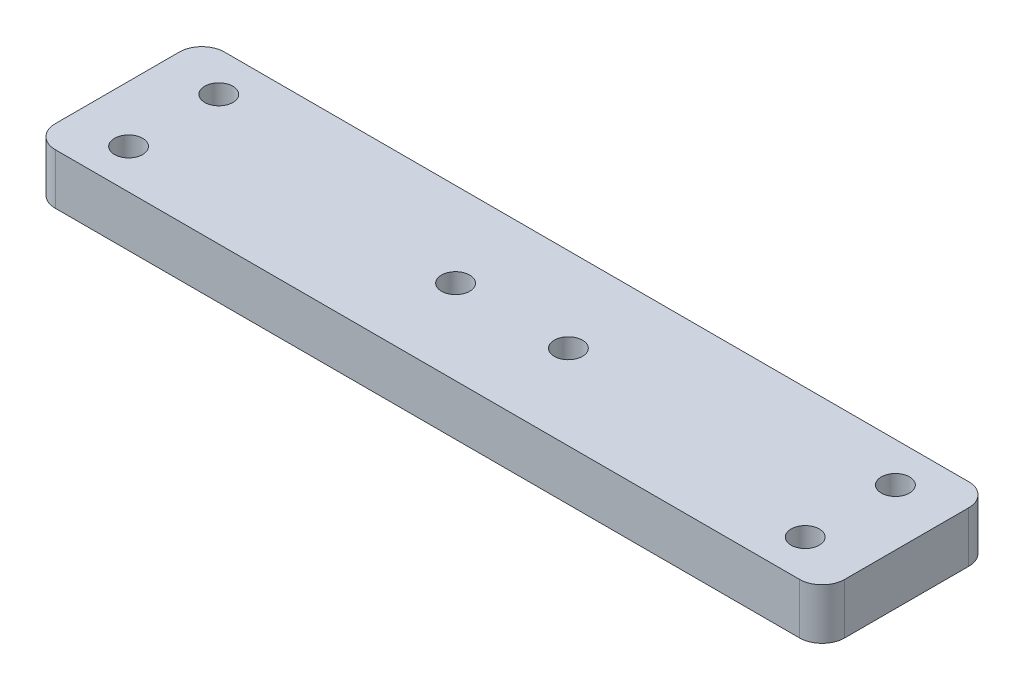
ISO-10303-21;
HEADER;
FILE_DESCRIPTION(('STEP AP214'),'2;1');
FILE_NAME('part.step','',(''),(''),'','','');
FILE_SCHEMA(('AUTOMOTIVE_DESIGN { 1 0 10303 214 1 1 1 1 }'));
ENDSEC;
DATA;
#1=APPLICATION_CONTEXT('core data for automotive mechanical design processes');
#2=APPLICATION_PROTOCOL_DEFINITION('international standard','automotive_design',2000,#1);
#3=PRODUCT_CONTEXT('',#1,'mechanical');
#4=PRODUCT('Part','Part','',(#3));
#5=PRODUCT_RELATED_PRODUCT_CATEGORY('part','',(#4));
#6=PRODUCT_DEFINITION_FORMATION('','',#4);
#7=PRODUCT_DEFINITION_CONTEXT('part definition',#1,'design');
#8=PRODUCT_DEFINITION('design','',#6,#7);
#9=PRODUCT_DEFINITION_SHAPE('','',#8);
#10=(LENGTH_UNIT() NAMED_UNIT(*) SI_UNIT(.MILLI.,.METRE.));
#11=(NAMED_UNIT(*) PLANE_ANGLE_UNIT() SI_UNIT($,.RADIAN.));
#12=(NAMED_UNIT(*) SI_UNIT($,.STERADIAN.) SOLID_ANGLE_UNIT());
#13=UNCERTAINTY_MEASURE_WITH_UNIT(LENGTH_MEASURE(1.E-05),#10,'distance_accuracy_value','');
#14=(GEOMETRIC_REPRESENTATION_CONTEXT(3) GLOBAL_UNCERTAINTY_ASSIGNED_CONTEXT((#13)) GLOBAL_UNIT_ASSIGNED_CONTEXT((#10,
#11,#12)) REPRESENTATION_CONTEXT('',''));
#15=CARTESIAN_POINT('',(0.,0.,0.));
#16=DIRECTION('',(0.,0.,1.));
#17=DIRECTION('',(1.,0.,0.));
#18=AXIS2_PLACEMENT_3D('',#15,#16,#17);
#19=CARTESIAN_POINT('',(33.,4.5,-5.5));
#20=DIRECTION('',(0.,1.,0.));
#21=DIRECTION('',(0.,0.,1.));
#22=AXIS2_PLACEMENT_3D('',#19,#20,#21);
#23=PLANE('',#22);
#24=CARTESIAN_POINT('',(-30.,4.5,4.));
#25=DIRECTION('',(0.,1.,0.));
#26=DIRECTION('',(0.,0.,1.));
#27=AXIS2_PLACEMENT_3D('',#24,#25,#26);
#28=CIRCLE('',#27,1.25);
#29=CARTESIAN_POINT('',(-30.,4.5,5.25));
#30=VERTEX_POINT('',#29);
#31=EDGE_CURVE('E203',#30,#30,#28,.T.);
#32=ORIENTED_EDGE('',*,*,#31,.F.);
#33=EDGE_LOOP('',(#32));
#34=FACE_BOUND('',#33,.T.);
#35=CARTESIAN_POINT('',(5.,4.5,0.));
#36=DIRECTION('',(0.,1.,0.));
#37=DIRECTION('',(0.,0.,1.));
#38=AXIS2_PLACEMENT_3D('',#35,#36,#37);
#39=CIRCLE('',#38,1.25);
#40=CARTESIAN_POINT('',(5.,4.5,1.25));
#41=VERTEX_POINT('',#40);
#42=EDGE_CURVE('E191',#41,#41,#39,.T.);
#43=ORIENTED_EDGE('',*,*,#42,.F.);
#44=EDGE_LOOP('',(#43));
#45=FACE_BOUND('',#44,.T.);
#46=CARTESIAN_POINT('',(-5.,4.5,0.));
#47=DIRECTION('',(0.,1.,0.));
#48=DIRECTION('',(0.,0.,1.));
#49=AXIS2_PLACEMENT_3D('',#46,#47,#48);
#50=CIRCLE('',#49,1.25);
#51=CARTESIAN_POINT('',(-5.,4.5,1.25));
#52=VERTEX_POINT('',#51);
#53=EDGE_CURVE('E137',#52,#52,#50,.T.);
#54=ORIENTED_EDGE('',*,*,#53,.F.);
#55=EDGE_LOOP('',(#54));
#56=FACE_BOUND('',#55,.T.);
#57=CARTESIAN_POINT('',(33.,4.5,-5.5));
#58=DIRECTION('',(0.,1.,0.));
#59=DIRECTION('',(0.,0.,1.));
#60=AXIS2_PLACEMENT_3D('',#57,#58,#59);
#61=CIRCLE('',#60,2.);
#62=CARTESIAN_POINT('',(35.,4.5,-5.5));
#63=VERTEX_POINT('',#62);
#64=CARTESIAN_POINT('',(33.,4.5,-7.5));
#65=VERTEX_POINT('',#64);
#66=EDGE_CURVE('E148',#63,#65,#61,.T.);
#67=ORIENTED_EDGE('',*,*,#66,.T.);
#68=DIRECTION('',(-1.,0.,0.));
#69=VECTOR('',#68,1.);
#70=CARTESIAN_POINT('',(-33.,4.5,-7.5));
#71=LINE('',#70,#69);
#72=CARTESIAN_POINT('',(-33.,4.5,-7.5));
#73=VERTEX_POINT('',#72);
#74=EDGE_CURVE('E96',#65,#73,#71,.T.);
#75=ORIENTED_EDGE('',*,*,#74,.T.);
#76=CARTESIAN_POINT('',(-33.,4.5,-5.5));
#77=DIRECTION('',(0.,1.,0.));
#78=DIRECTION('',(0.,0.,-1.));
#79=AXIS2_PLACEMENT_3D('',#76,#77,#78);
#80=CIRCLE('',#79,2.);
#81=CARTESIAN_POINT('',(-35.,4.5,-5.5));
#82=VERTEX_POINT('',#81);
#83=EDGE_CURVE('E163',#73,#82,#80,.T.);
#84=ORIENTED_EDGE('',*,*,#83,.T.);
#85=DIRECTION('',(0.,0.,1.));
#86=VECTOR('',#85,1.);
#87=CARTESIAN_POINT('',(-35.,4.5,-5.5));
#88=LINE('',#87,#86);
#89=CARTESIAN_POINT('',(-35.,4.5,5.5));
#90=VERTEX_POINT('',#89);
#91=EDGE_CURVE('E176',#82,#90,#88,.T.);
#92=ORIENTED_EDGE('',*,*,#91,.T.);
#93=CARTESIAN_POINT('',(-33.,4.5,5.5));
#94=DIRECTION('',(0.,1.,0.));
#95=DIRECTION('',(0.,0.,1.));
#96=AXIS2_PLACEMENT_3D('',#93,#94,#95);
#97=CIRCLE('',#96,2.);
#98=CARTESIAN_POINT('',(-33.,4.5,7.5));
#99=VERTEX_POINT('',#98);
#100=EDGE_CURVE('E115',#90,#99,#97,.T.);
#101=ORIENTED_EDGE('',*,*,#100,.T.);
#102=DIRECTION('',(1.,0.,0.));
#103=VECTOR('',#102,1.);
#104=CARTESIAN_POINT('',(-33.,4.5,7.5));
#105=LINE('',#104,#103);
#106=CARTESIAN_POINT('',(33.,4.5,7.5));
#107=VERTEX_POINT('',#106);
#108=EDGE_CURVE('E109',#99,#107,#105,.T.);
#109=ORIENTED_EDGE('',*,*,#108,.T.);
#110=CARTESIAN_POINT('',(33.,4.5,5.5));
#111=DIRECTION('',(0.,1.,0.));
#112=DIRECTION('',(0.,0.,-1.));
#113=AXIS2_PLACEMENT_3D('',#110,#111,#112);
#114=CIRCLE('',#113,2.);
#115=CARTESIAN_POINT('',(35.,4.5,5.5));
#116=VERTEX_POINT('',#115);
#117=EDGE_CURVE('E113',#107,#116,#114,.T.);
#118=ORIENTED_EDGE('',*,*,#117,.T.);
#119=DIRECTION('',(0.,0.,-1.));
#120=VECTOR('',#119,1.);
#121=CARTESIAN_POINT('',(35.,4.5,-5.5));
#122=LINE('',#121,#120);
#123=EDGE_CURVE('E53',#116,#63,#122,.T.);
#124=ORIENTED_EDGE('',*,*,#123,.T.);
#125=EDGE_LOOP('',(#67,#75,#84,#92,#101,#109,#118,#124));
#126=FACE_BOUND('',#125,.T.);
#127=CARTESIAN_POINT('',(-30.,4.5,-4.));
#128=DIRECTION('',(0.,1.,0.));
#129=DIRECTION('',(0.,0.,1.));
#130=AXIS2_PLACEMENT_3D('',#127,#128,#129);
#131=CIRCLE('',#130,1.25);
#132=CARTESIAN_POINT('',(-30.,4.5,-2.75));
#133=VERTEX_POINT('',#132);
#134=EDGE_CURVE('E185',#133,#133,#131,.T.);
#135=ORIENTED_EDGE('',*,*,#134,.F.);
#136=EDGE_LOOP('',(#135));
#137=FACE_BOUND('',#136,.T.);
#138=CARTESIAN_POINT('',(30.,4.5,-4.));
#139=DIRECTION('',(0.,1.,0.));
#140=DIRECTION('',(0.,0.,1.));
#141=AXIS2_PLACEMENT_3D('',#138,#139,#140);
#142=CIRCLE('',#141,1.25);
#143=CARTESIAN_POINT('',(30.,4.5,-2.75));
#144=VERTEX_POINT('',#143);
#145=EDGE_CURVE('E197',#144,#144,#142,.T.);
#146=ORIENTED_EDGE('',*,*,#145,.F.);
#147=EDGE_LOOP('',(#146));
#148=FACE_BOUND('',#147,.T.);
#149=CARTESIAN_POINT('',(30.,4.5,4.));
#150=DIRECTION('',(0.,1.,0.));
#151=DIRECTION('',(0.,0.,1.));
#152=AXIS2_PLACEMENT_3D('',#149,#150,#151);
#153=CIRCLE('',#152,1.25);
#154=CARTESIAN_POINT('',(30.,4.5,5.25));
#155=VERTEX_POINT('',#154);
#156=EDGE_CURVE('E209',#155,#155,#153,.T.);
#157=ORIENTED_EDGE('',*,*,#156,.F.);
#158=EDGE_LOOP('',(#157));
#159=FACE_BOUND('',#158,.T.);
#160=ADVANCED_FACE('F36',(#34,#45,#56,#126,#137,#148,#159),#23,.T.);
#161=CARTESIAN_POINT('',(33.,0.,-5.5));
#162=DIRECTION('',(0.,1.,0.));
#163=DIRECTION('',(0.,0.,1.));
#164=AXIS2_PLACEMENT_3D('',#161,#162,#163);
#165=PLANE('',#164);
#166=CARTESIAN_POINT('',(33.,0.,-5.5));
#167=DIRECTION('',(0.,1.,0.));
#168=DIRECTION('',(0.,0.,1.));
#169=AXIS2_PLACEMENT_3D('',#166,#167,#168);
#170=CIRCLE('',#169,2.);
#171=CARTESIAN_POINT('',(35.,0.,-5.5));
#172=VERTEX_POINT('',#171);
#173=CARTESIAN_POINT('',(33.,0.,-7.5));
#174=VERTEX_POINT('',#173);
#175=EDGE_CURVE('E133',#172,#174,#170,.T.);
#176=ORIENTED_EDGE('',*,*,#175,.F.);
#177=DIRECTION('',(0.,0.,-1.));
#178=VECTOR('',#177,1.);
#179=CARTESIAN_POINT('',(35.,0.,-5.5));
#180=LINE('',#179,#178);
#181=CARTESIAN_POINT('',(35.,0.,5.5));
#182=VERTEX_POINT('',#181);
#183=EDGE_CURVE('E88',#182,#172,#180,.T.);
#184=ORIENTED_EDGE('',*,*,#183,.F.);
#185=CARTESIAN_POINT('',(33.,0.,5.5));
#186=DIRECTION('',(0.,1.,0.));
#187=DIRECTION('',(0.,0.,-1.));
#188=AXIS2_PLACEMENT_3D('',#185,#186,#187);
#189=CIRCLE('',#188,2.);
#190=CARTESIAN_POINT('',(33.,0.,7.5));
#191=VERTEX_POINT('',#190);
#192=EDGE_CURVE('E82',#191,#182,#189,.T.);
#193=ORIENTED_EDGE('',*,*,#192,.F.);
#194=DIRECTION('',(1.,0.,0.));
#195=VECTOR('',#194,1.);
#196=CARTESIAN_POINT('',(-33.,0.,7.5));
#197=LINE('',#196,#195);
#198=CARTESIAN_POINT('',(-33.,0.,7.5));
#199=VERTEX_POINT('',#198);
#200=EDGE_CURVE('E123',#199,#191,#197,.T.);
#201=ORIENTED_EDGE('',*,*,#200,.F.);
#202=CARTESIAN_POINT('',(-33.,0.,5.5));
#203=DIRECTION('',(0.,1.,0.));
#204=DIRECTION('',(0.,0.,1.));
#205=AXIS2_PLACEMENT_3D('',#202,#203,#204);
#206=CIRCLE('',#205,2.);
#207=CARTESIAN_POINT('',(-35.,0.,5.5));
#208=VERTEX_POINT('',#207);
#209=EDGE_CURVE('E143',#208,#199,#206,.T.);
#210=ORIENTED_EDGE('',*,*,#209,.F.);
#211=DIRECTION('',(0.,0.,1.));
#212=VECTOR('',#211,1.);
#213=CARTESIAN_POINT('',(-35.,0.,-5.5));
#214=LINE('',#213,#212);
#215=CARTESIAN_POINT('',(-35.,0.,-5.5));
#216=VERTEX_POINT('',#215);
#217=EDGE_CURVE('E141',#216,#208,#214,.T.);
#218=ORIENTED_EDGE('',*,*,#217,.F.);
#219=CARTESIAN_POINT('',(-33.,0.,-5.5));
#220=DIRECTION('',(0.,1.,0.));
#221=DIRECTION('',(0.,0.,-1.));
#222=AXIS2_PLACEMENT_3D('',#219,#220,#221);
#223=CIRCLE('',#222,2.);
#224=CARTESIAN_POINT('',(-33.,0.,-7.5));
#225=VERTEX_POINT('',#224);
#226=EDGE_CURVE('E139',#225,#216,#223,.T.);
#227=ORIENTED_EDGE('',*,*,#226,.F.);
#228=DIRECTION('',(-1.,0.,0.));
#229=VECTOR('',#228,1.);
#230=CARTESIAN_POINT('',(-33.,0.,-7.5));
#231=LINE('',#230,#229);
#232=EDGE_CURVE('E136',#174,#225,#231,.T.);
#233=ORIENTED_EDGE('',*,*,#232,.F.);
#234=EDGE_LOOP('',(#176,#184,#193,#201,#210,#218,#227,#233));
#235=FACE_BOUND('',#234,.T.);
#236=CARTESIAN_POINT('',(-5.,0.,0.));
#237=DIRECTION('',(0.,1.,0.));
#238=DIRECTION('',(0.,0.,1.));
#239=AXIS2_PLACEMENT_3D('',#236,#237,#238);
#240=CIRCLE('',#239,1.25);
#241=CARTESIAN_POINT('',(-5.,0.,1.25));
#242=VERTEX_POINT('',#241);
#243=EDGE_CURVE('E182',#242,#242,#240,.T.);
#244=ORIENTED_EDGE('',*,*,#243,.T.);
#245=EDGE_LOOP('',(#244));
#246=FACE_BOUND('',#245,.T.);
#247=CARTESIAN_POINT('',(-30.,0.,-4.));
#248=DIRECTION('',(0.,1.,0.));
#249=DIRECTION('',(0.,0.,1.));
#250=AXIS2_PLACEMENT_3D('',#247,#248,#249);
#251=CIRCLE('',#250,1.25);
#252=CARTESIAN_POINT('',(-30.,0.,-2.75));
#253=VERTEX_POINT('',#252);
#254=EDGE_CURVE('E188',#253,#253,#251,.T.);
#255=ORIENTED_EDGE('',*,*,#254,.T.);
#256=EDGE_LOOP('',(#255));
#257=FACE_BOUND('',#256,.T.);
#258=CARTESIAN_POINT('',(5.,0.,0.));
#259=DIRECTION('',(0.,1.,0.));
#260=DIRECTION('',(0.,0.,1.));
#261=AXIS2_PLACEMENT_3D('',#258,#259,#260);
#262=CIRCLE('',#261,1.25);
#263=CARTESIAN_POINT('',(5.,0.,1.25));
#264=VERTEX_POINT('',#263);
#265=EDGE_CURVE('E194',#264,#264,#262,.T.);
#266=ORIENTED_EDGE('',*,*,#265,.T.);
#267=EDGE_LOOP('',(#266));
#268=FACE_BOUND('',#267,.T.);
#269=CARTESIAN_POINT('',(30.,0.,-4.));
#270=DIRECTION('',(0.,1.,0.));
#271=DIRECTION('',(0.,0.,1.));
#272=AXIS2_PLACEMENT_3D('',#269,#270,#271);
#273=CIRCLE('',#272,1.25);
#274=CARTESIAN_POINT('',(30.,0.,-2.75));
#275=VERTEX_POINT('',#274);
#276=EDGE_CURVE('E200',#275,#275,#273,.T.);
#277=ORIENTED_EDGE('',*,*,#276,.T.);
#278=EDGE_LOOP('',(#277));
#279=FACE_BOUND('',#278,.T.);
#280=CARTESIAN_POINT('',(-30.,0.,4.));
#281=DIRECTION('',(0.,1.,0.));
#282=DIRECTION('',(0.,0.,1.));
#283=AXIS2_PLACEMENT_3D('',#280,#281,#282);
#284=CIRCLE('',#283,1.25);
#285=CARTESIAN_POINT('',(-30.,0.,5.25));
#286=VERTEX_POINT('',#285);
#287=EDGE_CURVE('E206',#286,#286,#284,.T.);
#288=ORIENTED_EDGE('',*,*,#287,.T.);
#289=EDGE_LOOP('',(#288));
#290=FACE_BOUND('',#289,.T.);
#291=CARTESIAN_POINT('',(30.,0.,4.));
#292=DIRECTION('',(0.,1.,0.));
#293=DIRECTION('',(0.,0.,1.));
#294=AXIS2_PLACEMENT_3D('',#291,#292,#293);
#295=CIRCLE('',#294,1.25);
#296=CARTESIAN_POINT('',(30.,0.,5.25));
#297=VERTEX_POINT('',#296);
#298=EDGE_CURVE('E212',#297,#297,#295,.T.);
#299=ORIENTED_EDGE('',*,*,#298,.T.);
#300=EDGE_LOOP('',(#299));
#301=FACE_BOUND('',#300,.T.);
#302=ADVANCED_FACE('F167',(#235,#246,#257,#268,#279,#290,#301),#165,.F.);
#303=CARTESIAN_POINT('',(33.,4.5,-5.5));
#304=DIRECTION('',(0.,-1.,0.));
#305=DIRECTION('',(0.,0.,-1.));
#306=AXIS2_PLACEMENT_3D('',#303,#304,#305);
#307=CYLINDRICAL_SURFACE('',#306,2.);
#308=ORIENTED_EDGE('',*,*,#175,.T.);
#309=DIRECTION('',(0.,-1.,0.));
#310=VECTOR('',#309,1.);
#311=CARTESIAN_POINT('',(33.,4.5,-7.5));
#312=LINE('',#311,#310);
#313=EDGE_CURVE('E11',#65,#174,#312,.T.);
#314=ORIENTED_EDGE('',*,*,#313,.F.);
#315=ORIENTED_EDGE('',*,*,#66,.F.);
#316=DIRECTION('',(0.,-1.,0.));
#317=VECTOR('',#316,1.);
#318=CARTESIAN_POINT('',(35.,4.5,-5.5));
#319=LINE('',#318,#317);
#320=EDGE_CURVE('E129',#63,#172,#319,.T.);
#321=ORIENTED_EDGE('',*,*,#320,.T.);
#322=EDGE_LOOP('',(#308,#314,#315,#321));
#323=FACE_BOUND('',#322,.T.);
#324=ADVANCED_FACE('F38',(#323),#307,.T.);
#325=CARTESIAN_POINT('',(-33.,4.5,-7.5));
#326=DIRECTION('',(0.,0.,1.));
#327=DIRECTION('',(1.,0.,0.));
#328=AXIS2_PLACEMENT_3D('',#325,#326,#327);
#329=PLANE('',#328);
#330=ORIENTED_EDGE('',*,*,#232,.T.);
#331=DIRECTION('',(0.,-1.,0.));
#332=VECTOR('',#331,1.);
#333=CARTESIAN_POINT('',(-33.,4.5,-7.5));
#334=LINE('',#333,#332);
#335=EDGE_CURVE('E45',#73,#225,#334,.T.);
#336=ORIENTED_EDGE('',*,*,#335,.F.);
#337=ORIENTED_EDGE('',*,*,#74,.F.);
#338=ORIENTED_EDGE('',*,*,#313,.T.);
#339=EDGE_LOOP('',(#330,#336,#337,#338));
#340=FACE_BOUND('',#339,.T.);
#341=ADVANCED_FACE('F246',(#340),#329,.F.);
#342=CARTESIAN_POINT('',(-33.,4.5,-5.5));
#343=DIRECTION('',(0.,-1.,0.));
#344=DIRECTION('',(0.,0.,-1.));
#345=AXIS2_PLACEMENT_3D('',#342,#343,#344);
#346=CYLINDRICAL_SURFACE('',#345,2.);
#347=ORIENTED_EDGE('',*,*,#226,.T.);
#348=DIRECTION('',(0.,-1.,0.));
#349=VECTOR('',#348,1.);
#350=CARTESIAN_POINT('',(-35.,4.5,-5.5));
#351=LINE('',#350,#349);
#352=EDGE_CURVE('E155',#82,#216,#351,.T.);
#353=ORIENTED_EDGE('',*,*,#352,.F.);
#354=ORIENTED_EDGE('',*,*,#83,.F.);
#355=ORIENTED_EDGE('',*,*,#335,.T.);
#356=EDGE_LOOP('',(#347,#353,#354,#355));
#357=FACE_BOUND('',#356,.T.);
#358=ADVANCED_FACE('F161',(#357),#346,.T.);
#359=CARTESIAN_POINT('',(-35.,4.5,-5.5));
#360=DIRECTION('',(1.,0.,0.));
#361=DIRECTION('',(0.,0.,-1.));
#362=AXIS2_PLACEMENT_3D('',#359,#360,#361);
#363=PLANE('',#362);
#364=ORIENTED_EDGE('',*,*,#217,.T.);
#365=DIRECTION('',(0.,-1.,0.));
#366=VECTOR('',#365,1.);
#367=CARTESIAN_POINT('',(-35.,4.5,5.5));
#368=LINE('',#367,#366);
#369=EDGE_CURVE('E152',#90,#208,#368,.T.);
#370=ORIENTED_EDGE('',*,*,#369,.F.);
#371=ORIENTED_EDGE('',*,*,#91,.F.);
#372=ORIENTED_EDGE('',*,*,#352,.T.);
#373=EDGE_LOOP('',(#364,#370,#371,#372));
#374=FACE_BOUND('',#373,.T.);
#375=ADVANCED_FACE('F172',(#374),#363,.F.);
#376=CARTESIAN_POINT('',(-33.,4.5,5.5));
#377=DIRECTION('',(0.,-1.,0.));
#378=DIRECTION('',(0.,0.,-1.));
#379=AXIS2_PLACEMENT_3D('',#376,#377,#378);
#380=CYLINDRICAL_SURFACE('',#379,2.);
#381=ORIENTED_EDGE('',*,*,#209,.T.);
#382=DIRECTION('',(0.,-1.,0.));
#383=VECTOR('',#382,1.);
#384=CARTESIAN_POINT('',(-33.,4.5,7.5));
#385=LINE('',#384,#383);
#386=EDGE_CURVE('E124',#99,#199,#385,.T.);
#387=ORIENTED_EDGE('',*,*,#386,.F.);
#388=ORIENTED_EDGE('',*,*,#100,.F.);
#389=ORIENTED_EDGE('',*,*,#369,.T.);
#390=EDGE_LOOP('',(#381,#387,#388,#389));
#391=FACE_BOUND('',#390,.T.);
#392=ADVANCED_FACE('F175',(#391),#380,.T.);
#393=CARTESIAN_POINT('',(-33.,4.5,7.5));
#394=DIRECTION('',(0.,0.,-1.));
#395=DIRECTION('',(-1.,0.,0.));
#396=AXIS2_PLACEMENT_3D('',#393,#394,#395);
#397=PLANE('',#396);
#398=ORIENTED_EDGE('',*,*,#200,.T.);
#399=DIRECTION('',(0.,-1.,0.));
#400=VECTOR('',#399,1.);
#401=CARTESIAN_POINT('',(33.,4.5,7.5));
#402=LINE('',#401,#400);
#403=EDGE_CURVE('E120',#107,#191,#402,.T.);
#404=ORIENTED_EDGE('',*,*,#403,.F.);
#405=ORIENTED_EDGE('',*,*,#108,.F.);
#406=ORIENTED_EDGE('',*,*,#386,.T.);
#407=EDGE_LOOP('',(#398,#404,#405,#406));
#408=FACE_BOUND('',#407,.T.);
#409=ADVANCED_FACE('F121',(#408),#397,.F.);
#410=CARTESIAN_POINT('',(33.,4.5,5.5));
#411=DIRECTION('',(0.,-1.,0.));
#412=DIRECTION('',(0.,0.,-1.));
#413=AXIS2_PLACEMENT_3D('',#410,#411,#412);
#414=CYLINDRICAL_SURFACE('',#413,2.);
#415=ORIENTED_EDGE('',*,*,#192,.T.);
#416=DIRECTION('',(0.,-1.,0.));
#417=VECTOR('',#416,1.);
#418=CARTESIAN_POINT('',(35.,4.5,5.5));
#419=LINE('',#418,#417);
#420=EDGE_CURVE('E125',#116,#182,#419,.T.);
#421=ORIENTED_EDGE('',*,*,#420,.F.);
#422=ORIENTED_EDGE('',*,*,#117,.F.);
#423=ORIENTED_EDGE('',*,*,#403,.T.);
#424=EDGE_LOOP('',(#415,#421,#422,#423));
#425=FACE_BOUND('',#424,.T.);
#426=ADVANCED_FACE('F127',(#425),#414,.T.);
#427=CARTESIAN_POINT('',(35.,4.5,-5.5));
#428=DIRECTION('',(-1.,0.,0.));
#429=DIRECTION('',(0.,0.,1.));
#430=AXIS2_PLACEMENT_3D('',#427,#428,#429);
#431=PLANE('',#430);
#432=ORIENTED_EDGE('',*,*,#183,.T.);
#433=ORIENTED_EDGE('',*,*,#320,.F.);
#434=ORIENTED_EDGE('',*,*,#123,.F.);
#435=ORIENTED_EDGE('',*,*,#420,.T.);
#436=EDGE_LOOP('',(#432,#433,#434,#435));
#437=FACE_BOUND('',#436,.T.);
#438=ADVANCED_FACE('F234',(#437),#431,.F.);
#439=CARTESIAN_POINT('',(-5.,4.5,0.));
#440=DIRECTION('',(0.,-1.,0.));
#441=DIRECTION('',(0.,0.,-1.));
#442=AXIS2_PLACEMENT_3D('',#439,#440,#441);
#443=CYLINDRICAL_SURFACE('',#442,1.25);
#444=ORIENTED_EDGE('',*,*,#53,.T.);
#445=EDGE_LOOP('',(#444));
#446=FACE_BOUND('',#445,.T.);
#447=ORIENTED_EDGE('',*,*,#243,.F.);
#448=EDGE_LOOP('',(#447));
#449=FACE_BOUND('',#448,.T.);
#450=ADVANCED_FACE('F231',(#446,#449),#443,.F.);
#451=CARTESIAN_POINT('',(-30.,4.5,-4.));
#452=DIRECTION('',(0.,-1.,0.));
#453=DIRECTION('',(0.,0.,-1.));
#454=AXIS2_PLACEMENT_3D('',#451,#452,#453);
#455=CYLINDRICAL_SURFACE('',#454,1.25);
#456=ORIENTED_EDGE('',*,*,#134,.T.);
#457=EDGE_LOOP('',(#456));
#458=FACE_BOUND('',#457,.T.);
#459=ORIENTED_EDGE('',*,*,#254,.F.);
#460=EDGE_LOOP('',(#459));
#461=FACE_BOUND('',#460,.T.);
#462=ADVANCED_FACE('F310',(#458,#461),#455,.F.);
#463=CARTESIAN_POINT('',(5.,4.5,0.));
#464=DIRECTION('',(0.,-1.,0.));
#465=DIRECTION('',(0.,0.,-1.));
#466=AXIS2_PLACEMENT_3D('',#463,#464,#465);
#467=CYLINDRICAL_SURFACE('',#466,1.25);
#468=ORIENTED_EDGE('',*,*,#42,.T.);
#469=EDGE_LOOP('',(#468));
#470=FACE_BOUND('',#469,.T.);
#471=ORIENTED_EDGE('',*,*,#265,.F.);
#472=EDGE_LOOP('',(#471));
#473=FACE_BOUND('',#472,.T.);
#474=ADVANCED_FACE('F318',(#470,#473),#467,.F.);
#475=CARTESIAN_POINT('',(30.,4.5,-4.));
#476=DIRECTION('',(0.,-1.,0.));
#477=DIRECTION('',(0.,0.,-1.));
#478=AXIS2_PLACEMENT_3D('',#475,#476,#477);
#479=CYLINDRICAL_SURFACE('',#478,1.25);
#480=ORIENTED_EDGE('',*,*,#145,.T.);
#481=EDGE_LOOP('',(#480));
#482=FACE_BOUND('',#481,.T.);
#483=ORIENTED_EDGE('',*,*,#276,.F.);
#484=EDGE_LOOP('',(#483));
#485=FACE_BOUND('',#484,.T.);
#486=ADVANCED_FACE('F326',(#482,#485),#479,.F.);
#487=CARTESIAN_POINT('',(-30.,4.5,4.));
#488=DIRECTION('',(0.,-1.,0.));
#489=DIRECTION('',(0.,0.,-1.));
#490=AXIS2_PLACEMENT_3D('',#487,#488,#489);
#491=CYLINDRICAL_SURFACE('',#490,1.25);
#492=ORIENTED_EDGE('',*,*,#31,.T.);
#493=EDGE_LOOP('',(#492));
#494=FACE_BOUND('',#493,.T.);
#495=ORIENTED_EDGE('',*,*,#287,.F.);
#496=EDGE_LOOP('',(#495));
#497=FACE_BOUND('',#496,.T.);
#498=ADVANCED_FACE('F335',(#494,#497),#491,.F.);
#499=CARTESIAN_POINT('',(30.,4.5,4.));
#500=DIRECTION('',(0.,-1.,0.));
#501=DIRECTION('',(0.,0.,-1.));
#502=AXIS2_PLACEMENT_3D('',#499,#500,#501);
#503=CYLINDRICAL_SURFACE('',#502,1.25);
#504=ORIENTED_EDGE('',*,*,#156,.T.);
#505=EDGE_LOOP('',(#504));
#506=FACE_BOUND('',#505,.T.);
#507=ORIENTED_EDGE('',*,*,#298,.F.);
#508=EDGE_LOOP('',(#507));
#509=FACE_BOUND('',#508,.T.);
#510=ADVANCED_FACE('F218',(#506,#509),#503,.F.);
#511=CLOSED_SHELL('',(#160,#302,#324,#341,#358,#375,#392,#409,#426,#438,#450,#462,#474,#486,
#498,#510));
#512=MANIFOLD_SOLID_BREP('B2',#511);
#513=ADVANCED_BREP_SHAPE_REPRESENTATION('',(#18,#512),#14);
#514=SHAPE_DEFINITION_REPRESENTATION(#9,#513);
ENDSEC;
END-ISO-10303-21;
